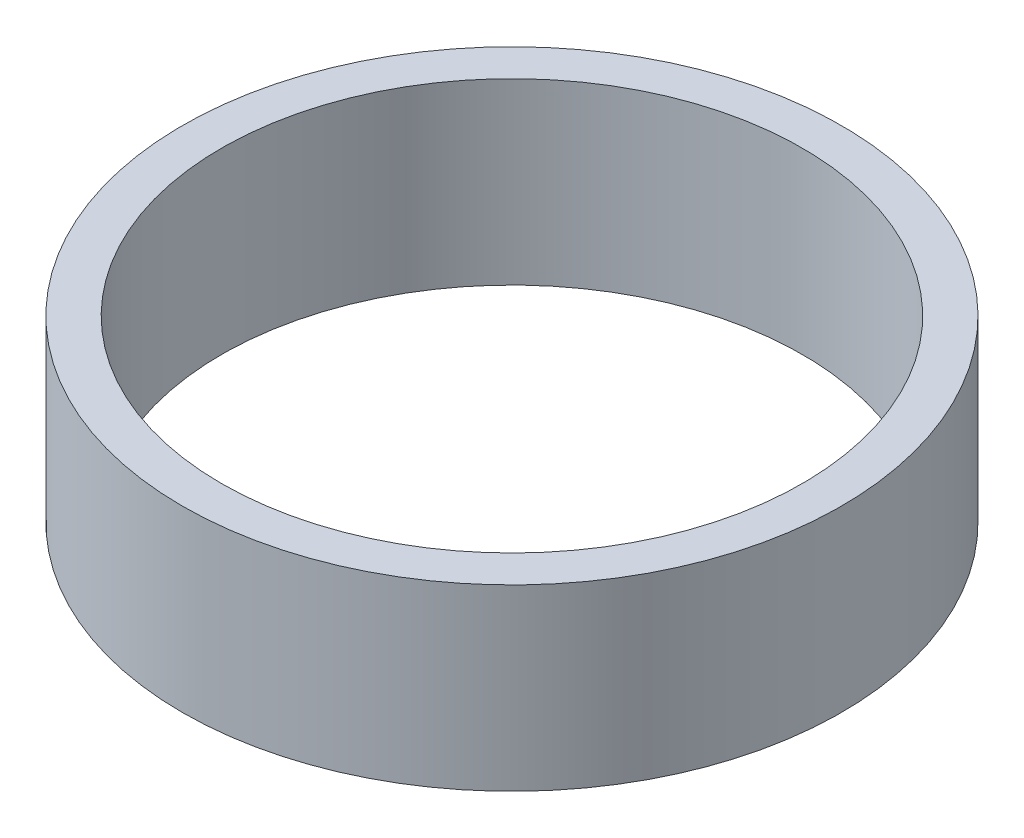
ISO-10303-21;
HEADER;
FILE_DESCRIPTION(('STEP AP214'),'2;1');
FILE_NAME('part.step','',(''),(''),'','','');
FILE_SCHEMA(('AUTOMOTIVE_DESIGN { 1 0 10303 214 1 1 1 1 }'));
ENDSEC;
DATA;
#1=APPLICATION_CONTEXT('core data for automotive mechanical design processes');
#2=APPLICATION_PROTOCOL_DEFINITION('international standard','automotive_design',2000,#1);
#3=PRODUCT_CONTEXT('',#1,'mechanical');
#4=PRODUCT('Part','Part','',(#3));
#5=PRODUCT_RELATED_PRODUCT_CATEGORY('part','',(#4));
#6=PRODUCT_DEFINITION_FORMATION('','',#4);
#7=PRODUCT_DEFINITION_CONTEXT('part definition',#1,'design');
#8=PRODUCT_DEFINITION('design','',#6,#7);
#9=PRODUCT_DEFINITION_SHAPE('','',#8);
#10=(LENGTH_UNIT() NAMED_UNIT(*) SI_UNIT(.MILLI.,.METRE.));
#11=(NAMED_UNIT(*) PLANE_ANGLE_UNIT() SI_UNIT($,.RADIAN.));
#12=(NAMED_UNIT(*) SI_UNIT($,.STERADIAN.) SOLID_ANGLE_UNIT());
#13=UNCERTAINTY_MEASURE_WITH_UNIT(LENGTH_MEASURE(1.E-05),#10,'distance_accuracy_value','');
#14=(GEOMETRIC_REPRESENTATION_CONTEXT(3) GLOBAL_UNCERTAINTY_ASSIGNED_CONTEXT((#13)) GLOBAL_UNIT_ASSIGNED_CONTEXT((#10,
#11,#12)) REPRESENTATION_CONTEXT('',''));
#15=CARTESIAN_POINT('',(0.,0.,0.));
#16=DIRECTION('',(0.,0.,1.));
#17=DIRECTION('',(1.,0.,0.));
#18=AXIS2_PLACEMENT_3D('',#15,#16,#17);
#19=CARTESIAN_POINT('',(0.,8.,0.));
#20=DIRECTION('',(0.,1.,0.));
#21=DIRECTION('',(0.,0.,1.));
#22=AXIS2_PLACEMENT_3D('',#19,#20,#21);
#23=PLANE('',#22);
#24=CARTESIAN_POINT('',(0.,8.,0.));
#25=DIRECTION('',(0.,1.,0.));
#26=DIRECTION('',(0.,0.,1.));
#27=AXIS2_PLACEMENT_3D('',#24,#25,#26);
#28=CIRCLE('',#27,14.75);
#29=CARTESIAN_POINT('',(0.,8.,14.75));
#30=VERTEX_POINT('',#29);
#31=EDGE_CURVE('E10',#30,#30,#28,.T.);
#32=ORIENTED_EDGE('',*,*,#31,.T.);
#33=EDGE_LOOP('',(#32));
#34=FACE_BOUND('',#33,.T.);
#35=CARTESIAN_POINT('',(0.,8.,0.));
#36=DIRECTION('',(0.,1.,0.));
#37=DIRECTION('',(0.,0.,1.));
#38=AXIS2_PLACEMENT_3D('',#35,#36,#37);
#39=CIRCLE('',#38,13.);
#40=CARTESIAN_POINT('',(0.,8.,13.));
#41=VERTEX_POINT('',#40);
#42=EDGE_CURVE('E50',#41,#41,#39,.T.);
#43=ORIENTED_EDGE('',*,*,#42,.F.);
#44=EDGE_LOOP('',(#43));
#45=FACE_BOUND('',#44,.T.);
#46=ADVANCED_FACE('F37',(#34,#45),#23,.T.);
#47=CARTESIAN_POINT('',(0.,0.,0.));
#48=DIRECTION('',(0.,1.,0.));
#49=DIRECTION('',(0.,0.,1.));
#50=AXIS2_PLACEMENT_3D('',#47,#48,#49);
#51=PLANE('',#50);
#52=CARTESIAN_POINT('',(0.,0.,0.));
#53=DIRECTION('',(0.,1.,0.));
#54=DIRECTION('',(0.,0.,1.));
#55=AXIS2_PLACEMENT_3D('',#52,#53,#54);
#56=CIRCLE('',#55,14.75);
#57=CARTESIAN_POINT('',(0.,0.,14.75));
#58=VERTEX_POINT('',#57);
#59=EDGE_CURVE('E41',#58,#58,#56,.T.);
#60=ORIENTED_EDGE('',*,*,#59,.F.);
#61=EDGE_LOOP('',(#60));
#62=FACE_BOUND('',#61,.T.);
#63=CARTESIAN_POINT('',(0.,0.,0.));
#64=DIRECTION('',(0.,1.,0.));
#65=DIRECTION('',(0.,0.,1.));
#66=AXIS2_PLACEMENT_3D('',#63,#64,#65);
#67=CIRCLE('',#66,13.);
#68=CARTESIAN_POINT('',(0.,0.,13.));
#69=VERTEX_POINT('',#68);
#70=EDGE_CURVE('E52',#69,#69,#67,.T.);
#71=ORIENTED_EDGE('',*,*,#70,.T.);
#72=EDGE_LOOP('',(#71));
#73=FACE_BOUND('',#72,.T.);
#74=ADVANCED_FACE('F64',(#62,#73),#51,.F.);
#75=CARTESIAN_POINT('',(0.,8.,0.));
#76=DIRECTION('',(0.,-1.,0.));
#77=DIRECTION('',(0.,0.,-1.));
#78=AXIS2_PLACEMENT_3D('',#75,#76,#77);
#79=CYLINDRICAL_SURFACE('',#78,14.75);
#80=ORIENTED_EDGE('',*,*,#31,.F.);
#81=EDGE_LOOP('',(#80));
#82=FACE_BOUND('',#81,.T.);
#83=ORIENTED_EDGE('',*,*,#59,.T.);
#84=EDGE_LOOP('',(#83));
#85=FACE_BOUND('',#84,.T.);
#86=ADVANCED_FACE('F39',(#82,#85),#79,.T.);
#87=CARTESIAN_POINT('',(0.,8.,0.));
#88=DIRECTION('',(0.,-1.,0.));
#89=DIRECTION('',(0.,0.,-1.));
#90=AXIS2_PLACEMENT_3D('',#87,#88,#89);
#91=CYLINDRICAL_SURFACE('',#90,13.);
#92=ORIENTED_EDGE('',*,*,#42,.T.);
#93=EDGE_LOOP('',(#92));
#94=FACE_BOUND('',#93,.T.);
#95=ORIENTED_EDGE('',*,*,#70,.F.);
#96=EDGE_LOOP('',(#95));
#97=FACE_BOUND('',#96,.T.);
#98=ADVANCED_FACE('F60',(#94,#97),#91,.F.);
#99=CLOSED_SHELL('',(#46,#74,#86,#98));
#100=MANIFOLD_SOLID_BREP('B2',#99);
#101=ADVANCED_BREP_SHAPE_REPRESENTATION('',(#18,#100),#14);
#102=SHAPE_DEFINITION_REPRESENTATION(#9,#101);
ENDSEC;
END-ISO-10303-21;
